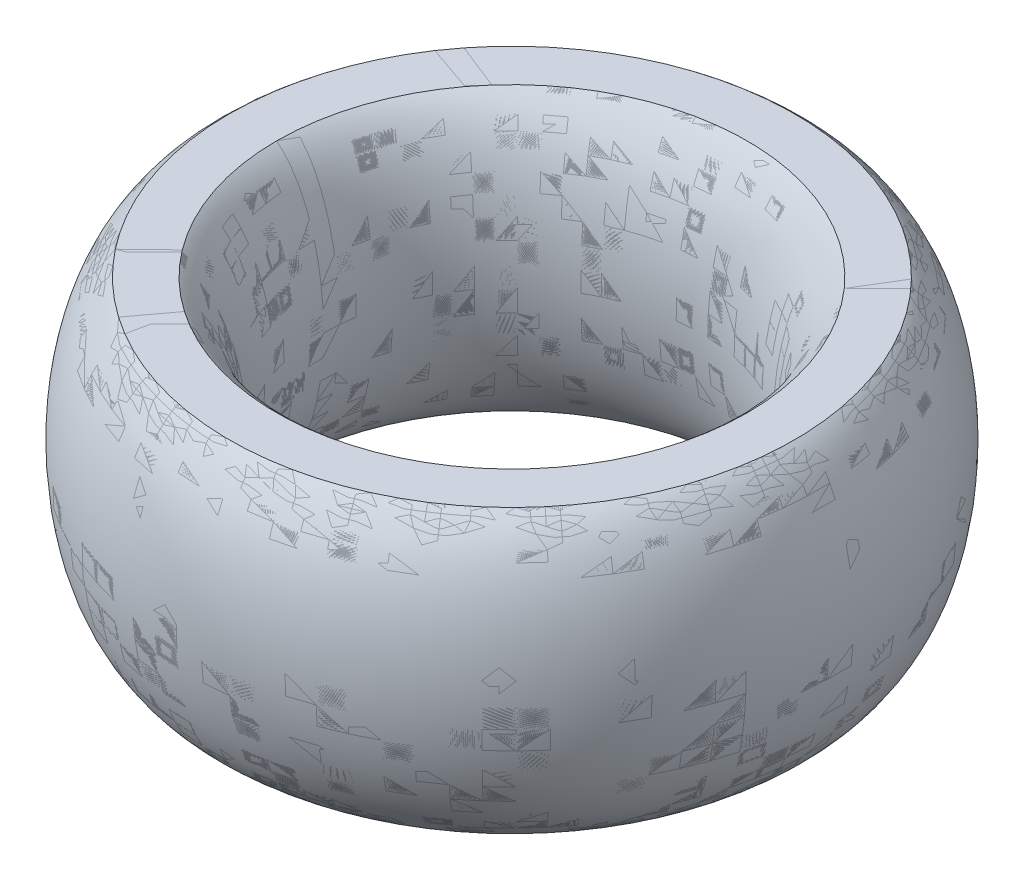
ISO-10303-21;
HEADER;
FILE_DESCRIPTION(('STEP AP214'),'2;1');
FILE_NAME('part.step','',(''),(''),'','','');
FILE_SCHEMA(('AUTOMOTIVE_DESIGN { 1 0 10303 214 1 1 1 1 }'));
ENDSEC;
DATA;
#1=APPLICATION_CONTEXT('core data for automotive mechanical design processes');
#2=APPLICATION_PROTOCOL_DEFINITION('international standard','automotive_design',2000,#1);
#3=PRODUCT_CONTEXT('',#1,'mechanical');
#4=PRODUCT('Part','Part','',(#3));
#5=PRODUCT_RELATED_PRODUCT_CATEGORY('part','',(#4));
#6=PRODUCT_DEFINITION_FORMATION('','',#4);
#7=PRODUCT_DEFINITION_CONTEXT('part definition',#1,'design');
#8=PRODUCT_DEFINITION('design','',#6,#7);
#9=PRODUCT_DEFINITION_SHAPE('','',#8);
#10=(LENGTH_UNIT() NAMED_UNIT(*) SI_UNIT(.MILLI.,.METRE.));
#11=(NAMED_UNIT(*) PLANE_ANGLE_UNIT() SI_UNIT($,.RADIAN.));
#12=(NAMED_UNIT(*) SI_UNIT($,.STERADIAN.) SOLID_ANGLE_UNIT());
#13=UNCERTAINTY_MEASURE_WITH_UNIT(LENGTH_MEASURE(1.E-05),#10,'distance_accuracy_value','');
#14=(GEOMETRIC_REPRESENTATION_CONTEXT(3) GLOBAL_UNCERTAINTY_ASSIGNED_CONTEXT((#13)) GLOBAL_UNIT_ASSIGNED_CONTEXT((#10,
#11,#12)) REPRESENTATION_CONTEXT('',''));
#15=CARTESIAN_POINT('',(0.,0.,0.));
#16=DIRECTION('',(0.,0.,1.));
#17=DIRECTION('',(1.,0.,0.));
#18=AXIS2_PLACEMENT_3D('',#15,#16,#17);
#19=CARTESIAN_POINT('',(55.,0.,0.));
#20=DIRECTION('',(0.,0.,-1.));
#21=DIRECTION('',(0.,-1.,0.));
#22=AXIS2_PLACEMENT_3D('',#19,#20,#21);
#23=ELLIPSE('',#22,15.9099025766973,7.5);
#24=CARTESIAN_POINT('',(27.5,15.,0.));
#25=DIRECTION('',(0.,1.,0.));
#26=AXIS1_PLACEMENT('',#24,#25);
#27=SURFACE_OF_REVOLUTION('',#23,#26);
#28=CARTESIAN_POINT('',(27.5,-15.,0.));
#29=DIRECTION('',(0.,1.,0.));
#30=DIRECTION('',(-1.,0.,0.));
#31=AXIS2_PLACEMENT_3D('',#28,#29,#30);
#32=CIRCLE('',#31,30.);
#33=CARTESIAN_POINT('',(-2.5,-15.,0.));
#34=VERTEX_POINT('',#33);
#35=EDGE_CURVE('E60',#34,#34,#32,.T.);
#36=ORIENTED_EDGE('',*,*,#35,.T.);
#37=EDGE_LOOP('',(#36));
#38=FACE_BOUND('',#37,.T.);
#39=CARTESIAN_POINT('',(27.5,15.,0.));
#40=DIRECTION('',(0.,1.,0.));
#41=DIRECTION('',(-1.,0.,0.));
#42=AXIS2_PLACEMENT_3D('',#39,#40,#41);
#43=CIRCLE('',#42,30.);
#44=CARTESIAN_POINT('',(-2.5,15.,0.));
#45=VERTEX_POINT('',#44);
#46=EDGE_CURVE('E11',#45,#45,#43,.T.);
#47=ORIENTED_EDGE('',*,*,#46,.F.);
#48=EDGE_LOOP('',(#47));
#49=FACE_BOUND('',#48,.T.);
#50=ADVANCED_FACE('F45',(#38,#49),#27,.F.);
#51=CARTESIAN_POINT('',(0.,15.,0.));
#52=DIRECTION('',(0.,-1.,0.));
#53=DIRECTION('',(1.,0.,0.));
#54=AXIS2_PLACEMENT_3D('',#51,#52,#53);
#55=PLANE('',#54);
#56=CARTESIAN_POINT('',(27.5,15.,0.));
#57=DIRECTION('',(0.,1.,0.));
#58=DIRECTION('',(-1.,0.,0.));
#59=AXIS2_PLACEMENT_3D('',#56,#57,#58);
#60=CIRCLE('',#59,25.);
#61=CARTESIAN_POINT('',(2.5,15.,0.));
#62=VERTEX_POINT('',#61);
#63=EDGE_CURVE('E52',#62,#62,#60,.T.);
#64=ORIENTED_EDGE('',*,*,#63,.F.);
#65=EDGE_LOOP('',(#64));
#66=FACE_BOUND('',#65,.T.);
#67=ORIENTED_EDGE('',*,*,#46,.T.);
#68=EDGE_LOOP('',(#67));
#69=FACE_BOUND('',#68,.T.);
#70=ADVANCED_FACE('F72',(#66,#69),#55,.F.);
#71=CARTESIAN_POINT('',(55.,0.,0.));
#72=DIRECTION('',(0.,0.,-1.));
#73=DIRECTION('',(0.,-1.,0.));
#74=AXIS2_PLACEMENT_3D('',#71,#72,#73);
#75=ELLIPSE('',#74,15.9099025766973,7.5);
#76=CARTESIAN_POINT('',(27.5,15.,0.));
#77=DIRECTION('',(0.,1.,0.));
#78=AXIS1_PLACEMENT('',#76,#77);
#79=SURFACE_OF_REVOLUTION('',#75,#78);
#80=ORIENTED_EDGE('',*,*,#63,.T.);
#81=EDGE_LOOP('',(#80));
#82=FACE_BOUND('',#81,.T.);
#83=CARTESIAN_POINT('',(27.5,-15.,0.));
#84=DIRECTION('',(0.,1.,0.));
#85=DIRECTION('',(-1.,0.,0.));
#86=AXIS2_PLACEMENT_3D('',#83,#84,#85);
#87=CIRCLE('',#86,25.);
#88=CARTESIAN_POINT('',(2.5,-15.,0.));
#89=VERTEX_POINT('',#88);
#90=EDGE_CURVE('E56',#89,#89,#87,.T.);
#91=ORIENTED_EDGE('',*,*,#90,.F.);
#92=EDGE_LOOP('',(#91));
#93=FACE_BOUND('',#92,.T.);
#94=ADVANCED_FACE('F68',(#82,#93),#79,.F.);
#95=CARTESIAN_POINT('',(0.,-15.,0.));
#96=DIRECTION('',(0.,-1.,0.));
#97=DIRECTION('',(1.,0.,0.));
#98=AXIS2_PLACEMENT_3D('',#95,#96,#97);
#99=PLANE('',#98);
#100=ORIENTED_EDGE('',*,*,#90,.T.);
#101=EDGE_LOOP('',(#100));
#102=FACE_BOUND('',#101,.T.);
#103=ORIENTED_EDGE('',*,*,#35,.F.);
#104=EDGE_LOOP('',(#103));
#105=FACE_BOUND('',#104,.T.);
#106=ADVANCED_FACE('F71',(#102,#105),#99,.T.);
#107=CLOSED_SHELL('',(#50,#70,#94,#106));
#108=MANIFOLD_SOLID_BREP('B2',#107);
#109=CARTESIAN_POINT('',(0.,-15.,0.));
#110=DIRECTION('',(0.,-1.,0.));
#111=DIRECTION('',(1.,0.,0.));
#112=AXIS2_PLACEMENT_3D('',#109,#110,#111);
#113=PLANE('',#112);
#114=CARTESIAN_POINT('',(27.5,-15.,0.));
#115=DIRECTION('',(0.,1.,0.));
#116=DIRECTION('',(-1.,0.,0.));
#117=AXIS2_PLACEMENT_3D('',#114,#115,#116);
#118=CIRCLE('',#117,25.);
#119=CARTESIAN_POINT('',(2.5,-15.,0.));
#120=VERTEX_POINT('',#119);
#121=EDGE_CURVE('E44',#120,#120,#118,.T.);
#122=ORIENTED_EDGE('',*,*,#121,.T.);
#123=EDGE_LOOP('',(#122));
#124=FACE_BOUND('',#123,.T.);
#125=CARTESIAN_POINT('',(27.5,-15.,0.));
#126=DIRECTION('',(0.,1.,0.));
#127=DIRECTION('',(-1.,0.,0.));
#128=AXIS2_PLACEMENT_3D('',#125,#126,#127);
#129=CIRCLE('',#128,30.);
#130=CARTESIAN_POINT('',(-2.5,-15.,0.));
#131=VERTEX_POINT('',#130);
#132=EDGE_CURVE('E124',#131,#131,#129,.T.);
#133=ORIENTED_EDGE('',*,*,#132,.F.);
#134=EDGE_LOOP('',(#133));
#135=FACE_BOUND('',#134,.T.);
#136=ADVANCED_FACE('F110',(#124,#135),#113,.T.);
#137=CARTESIAN_POINT('',(0.,0.,0.));
#138=DIRECTION('',(0.,0.,1.));
#139=DIRECTION('',(0.,-1.,0.));
#140=AXIS2_PLACEMENT_3D('',#137,#138,#139);
#141=ELLIPSE('',#140,15.9099025766973,7.5);
#142=CARTESIAN_POINT('',(27.5,15.,0.));
#143=DIRECTION('',(0.,1.,0.));
#144=AXIS1_PLACEMENT('',#142,#143);
#145=SURFACE_OF_REVOLUTION('',#141,#144);
#146=CARTESIAN_POINT('',(27.5,15.,0.));
#147=DIRECTION('',(0.,1.,0.));
#148=DIRECTION('',(-1.,0.,0.));
#149=AXIS2_PLACEMENT_3D('',#146,#147,#148);
#150=CIRCLE('',#149,25.);
#151=CARTESIAN_POINT('',(2.5,15.,0.));
#152=VERTEX_POINT('',#151);
#153=EDGE_CURVE('E116',#152,#152,#150,.T.);
#154=ORIENTED_EDGE('',*,*,#153,.T.);
#155=EDGE_LOOP('',(#154));
#156=FACE_BOUND('',#155,.T.);
#157=ORIENTED_EDGE('',*,*,#121,.F.);
#158=EDGE_LOOP('',(#157));
#159=FACE_BOUND('',#158,.T.);
#160=ADVANCED_FACE('F139',(#156,#159),#145,.F.);
#161=CARTESIAN_POINT('',(0.,15.,0.));
#162=DIRECTION('',(0.,-1.,0.));
#163=DIRECTION('',(1.,0.,0.));
#164=AXIS2_PLACEMENT_3D('',#161,#162,#163);
#165=PLANE('',#164);
#166=ORIENTED_EDGE('',*,*,#153,.F.);
#167=EDGE_LOOP('',(#166));
#168=FACE_BOUND('',#167,.T.);
#169=CARTESIAN_POINT('',(27.5,15.,0.));
#170=DIRECTION('',(0.,1.,0.));
#171=DIRECTION('',(-1.,0.,0.));
#172=AXIS2_PLACEMENT_3D('',#169,#170,#171);
#173=CIRCLE('',#172,30.);
#174=CARTESIAN_POINT('',(-2.5,15.,0.));
#175=VERTEX_POINT('',#174);
#176=EDGE_CURVE('E120',#175,#175,#173,.T.);
#177=ORIENTED_EDGE('',*,*,#176,.T.);
#178=EDGE_LOOP('',(#177));
#179=FACE_BOUND('',#178,.T.);
#180=ADVANCED_FACE('F136',(#168,#179),#165,.F.);
#181=CARTESIAN_POINT('',(0.,0.,0.));
#182=DIRECTION('',(0.,0.,1.));
#183=DIRECTION('',(0.,-1.,0.));
#184=AXIS2_PLACEMENT_3D('',#181,#182,#183);
#185=ELLIPSE('',#184,15.9099025766973,7.5);
#186=CARTESIAN_POINT('',(27.5,15.,0.));
#187=DIRECTION('',(0.,1.,0.));
#188=AXIS1_PLACEMENT('',#186,#187);
#189=SURFACE_OF_REVOLUTION('',#185,#188);
#190=ORIENTED_EDGE('',*,*,#132,.T.);
#191=EDGE_LOOP('',(#190));
#192=FACE_BOUND('',#191,.T.);
#193=ORIENTED_EDGE('',*,*,#176,.F.);
#194=EDGE_LOOP('',(#193));
#195=FACE_BOUND('',#194,.T.);
#196=ADVANCED_FACE('F133',(#192,#195),#189,.F.);
#197=CLOSED_SHELL('',(#136,#160,#180,#196));
#198=MANIFOLD_SOLID_BREP('B6',#197);
#199=ADVANCED_BREP_SHAPE_REPRESENTATION('',(#18,#108,#198),#14);
#200=SHAPE_DEFINITION_REPRESENTATION(#9,#199);
ENDSEC;
END-ISO-10303-21;
